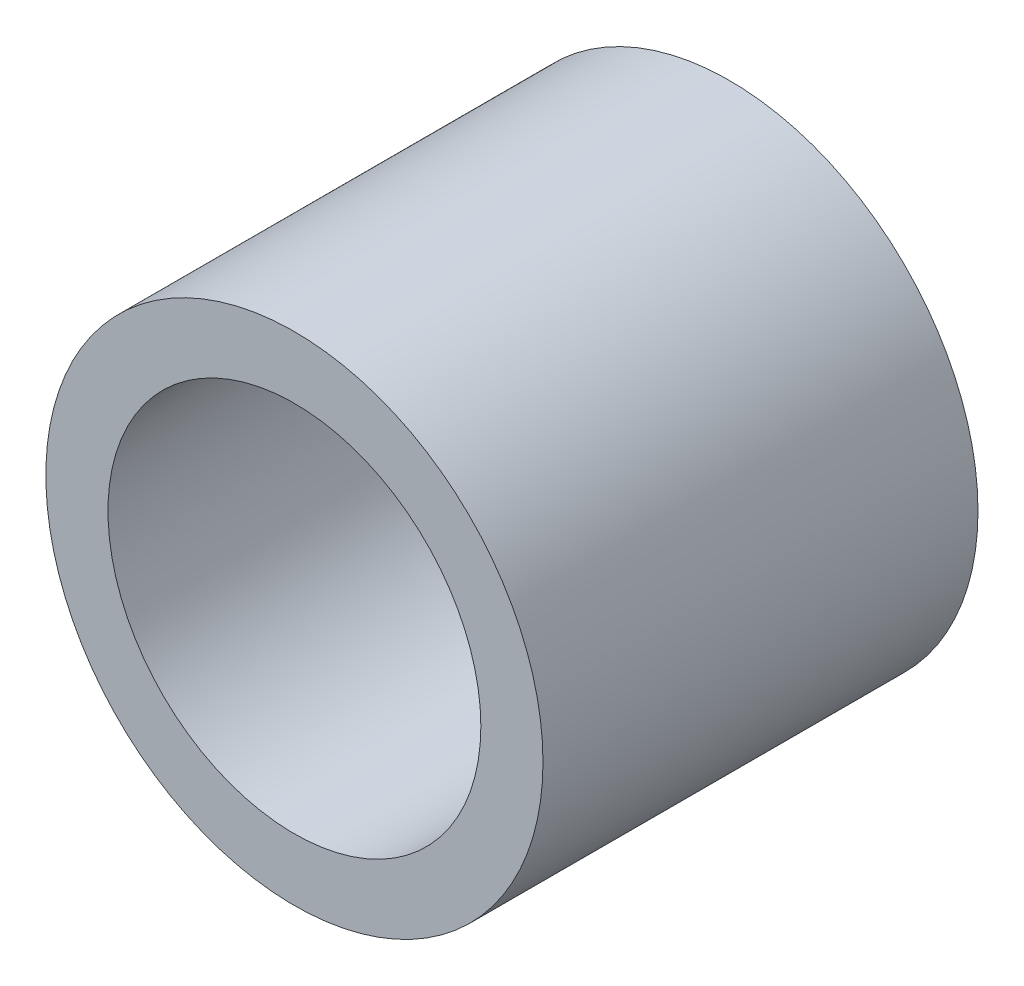
ISO-10303-21;
HEADER;
FILE_DESCRIPTION(('STEP AP214'),'2;1');
FILE_NAME('part.step','',(''),(''),'','','');
FILE_SCHEMA(('AUTOMOTIVE_DESIGN { 1 0 10303 214 1 1 1 1 }'));
ENDSEC;
DATA;
#1=APPLICATION_CONTEXT('core data for automotive mechanical design processes');
#2=APPLICATION_PROTOCOL_DEFINITION('international standard','automotive_design',2000,#1);
#3=PRODUCT_CONTEXT('',#1,'mechanical');
#4=PRODUCT('Part','Part','',(#3));
#5=PRODUCT_RELATED_PRODUCT_CATEGORY('part','',(#4));
#6=PRODUCT_DEFINITION_FORMATION('','',#4);
#7=PRODUCT_DEFINITION_CONTEXT('part definition',#1,'design');
#8=PRODUCT_DEFINITION('design','',#6,#7);
#9=PRODUCT_DEFINITION_SHAPE('','',#8);
#10=(LENGTH_UNIT() NAMED_UNIT(*) SI_UNIT(.MILLI.,.METRE.));
#11=(NAMED_UNIT(*) PLANE_ANGLE_UNIT() SI_UNIT($,.RADIAN.));
#12=(NAMED_UNIT(*) SI_UNIT($,.STERADIAN.) SOLID_ANGLE_UNIT());
#13=UNCERTAINTY_MEASURE_WITH_UNIT(LENGTH_MEASURE(1.E-05),#10,'distance_accuracy_value','');
#14=(GEOMETRIC_REPRESENTATION_CONTEXT(3) GLOBAL_UNCERTAINTY_ASSIGNED_CONTEXT((#13)) GLOBAL_UNIT_ASSIGNED_CONTEXT((#10,
#11,#12)) REPRESENTATION_CONTEXT('',''));
#15=CARTESIAN_POINT('',(0.,0.,0.));
#16=DIRECTION('',(0.,0.,1.));
#17=DIRECTION('',(1.,0.,0.));
#18=AXIS2_PLACEMENT_3D('',#15,#16,#17);
#19=CARTESIAN_POINT('',(0.,0.,7.));
#20=DIRECTION('',(0.,0.,1.));
#21=DIRECTION('',(1.,0.,0.));
#22=AXIS2_PLACEMENT_3D('',#19,#20,#21);
#23=PLANE('',#22);
#24=CARTESIAN_POINT('',(0.,0.,7.));
#25=DIRECTION('',(0.,0.,1.));
#26=DIRECTION('',(1.,0.,0.));
#27=AXIS2_PLACEMENT_3D('',#24,#25,#26);
#28=CIRCLE('',#27,4.);
#29=CARTESIAN_POINT('',(4.,0.,7.));
#30=VERTEX_POINT('',#29);
#31=EDGE_CURVE('E10',#30,#30,#28,.T.);
#32=ORIENTED_EDGE('',*,*,#31,.T.);
#33=EDGE_LOOP('',(#32));
#34=FACE_BOUND('',#33,.T.);
#35=CARTESIAN_POINT('',(0.,0.,7.));
#36=DIRECTION('',(0.,0.,1.));
#37=DIRECTION('',(1.,0.,0.));
#38=AXIS2_PLACEMENT_3D('',#35,#36,#37);
#39=CIRCLE('',#38,3.);
#40=CARTESIAN_POINT('',(3.,0.,7.));
#41=VERTEX_POINT('',#40);
#42=EDGE_CURVE('E44',#41,#41,#39,.T.);
#43=ORIENTED_EDGE('',*,*,#42,.F.);
#44=EDGE_LOOP('',(#43));
#45=FACE_BOUND('',#44,.T.);
#46=ADVANCED_FACE('F33',(#34,#45),#23,.T.);
#47=CARTESIAN_POINT('',(0.,0.,0.));
#48=DIRECTION('',(0.,0.,1.));
#49=DIRECTION('',(1.,0.,0.));
#50=AXIS2_PLACEMENT_3D('',#47,#48,#49);
#51=PLANE('',#50);
#52=CARTESIAN_POINT('',(0.,0.,0.));
#53=DIRECTION('',(0.,0.,1.));
#54=DIRECTION('',(1.,0.,0.));
#55=AXIS2_PLACEMENT_3D('',#52,#53,#54);
#56=CIRCLE('',#55,4.);
#57=CARTESIAN_POINT('',(4.,0.,0.));
#58=VERTEX_POINT('',#57);
#59=EDGE_CURVE('E37',#58,#58,#56,.T.);
#60=ORIENTED_EDGE('',*,*,#59,.F.);
#61=EDGE_LOOP('',(#60));
#62=FACE_BOUND('',#61,.T.);
#63=CARTESIAN_POINT('',(0.,0.,0.));
#64=DIRECTION('',(0.,0.,1.));
#65=DIRECTION('',(1.,0.,0.));
#66=AXIS2_PLACEMENT_3D('',#63,#64,#65);
#67=CIRCLE('',#66,3.);
#68=CARTESIAN_POINT('',(3.,0.,0.));
#69=VERTEX_POINT('',#68);
#70=EDGE_CURVE('E46',#69,#69,#67,.T.);
#71=ORIENTED_EDGE('',*,*,#70,.T.);
#72=EDGE_LOOP('',(#71));
#73=FACE_BOUND('',#72,.T.);
#74=ADVANCED_FACE('F56',(#62,#73),#51,.F.);
#75=CARTESIAN_POINT('',(0.,0.,7.));
#76=DIRECTION('',(0.,0.,-1.));
#77=DIRECTION('',(-1.,0.,0.));
#78=AXIS2_PLACEMENT_3D('',#75,#76,#77);
#79=CYLINDRICAL_SURFACE('',#78,4.);
#80=ORIENTED_EDGE('',*,*,#31,.F.);
#81=EDGE_LOOP('',(#80));
#82=FACE_BOUND('',#81,.T.);
#83=ORIENTED_EDGE('',*,*,#59,.T.);
#84=EDGE_LOOP('',(#83));
#85=FACE_BOUND('',#84,.T.);
#86=ADVANCED_FACE('F35',(#82,#85),#79,.T.);
#87=CARTESIAN_POINT('',(0.,0.,7.));
#88=DIRECTION('',(0.,0.,-1.));
#89=DIRECTION('',(-1.,0.,0.));
#90=AXIS2_PLACEMENT_3D('',#87,#88,#89);
#91=CYLINDRICAL_SURFACE('',#90,3.);
#92=ORIENTED_EDGE('',*,*,#42,.T.);
#93=EDGE_LOOP('',(#92));
#94=FACE_BOUND('',#93,.T.);
#95=ORIENTED_EDGE('',*,*,#70,.F.);
#96=EDGE_LOOP('',(#95));
#97=FACE_BOUND('',#96,.T.);
#98=ADVANCED_FACE('F52',(#94,#97),#91,.F.);
#99=CLOSED_SHELL('',(#46,#74,#86,#98));
#100=MANIFOLD_SOLID_BREP('B2',#99);
#101=ADVANCED_BREP_SHAPE_REPRESENTATION('',(#18,#100),#14);
#102=SHAPE_DEFINITION_REPRESENTATION(#9,#101);
ENDSEC;
END-ISO-10303-21;
